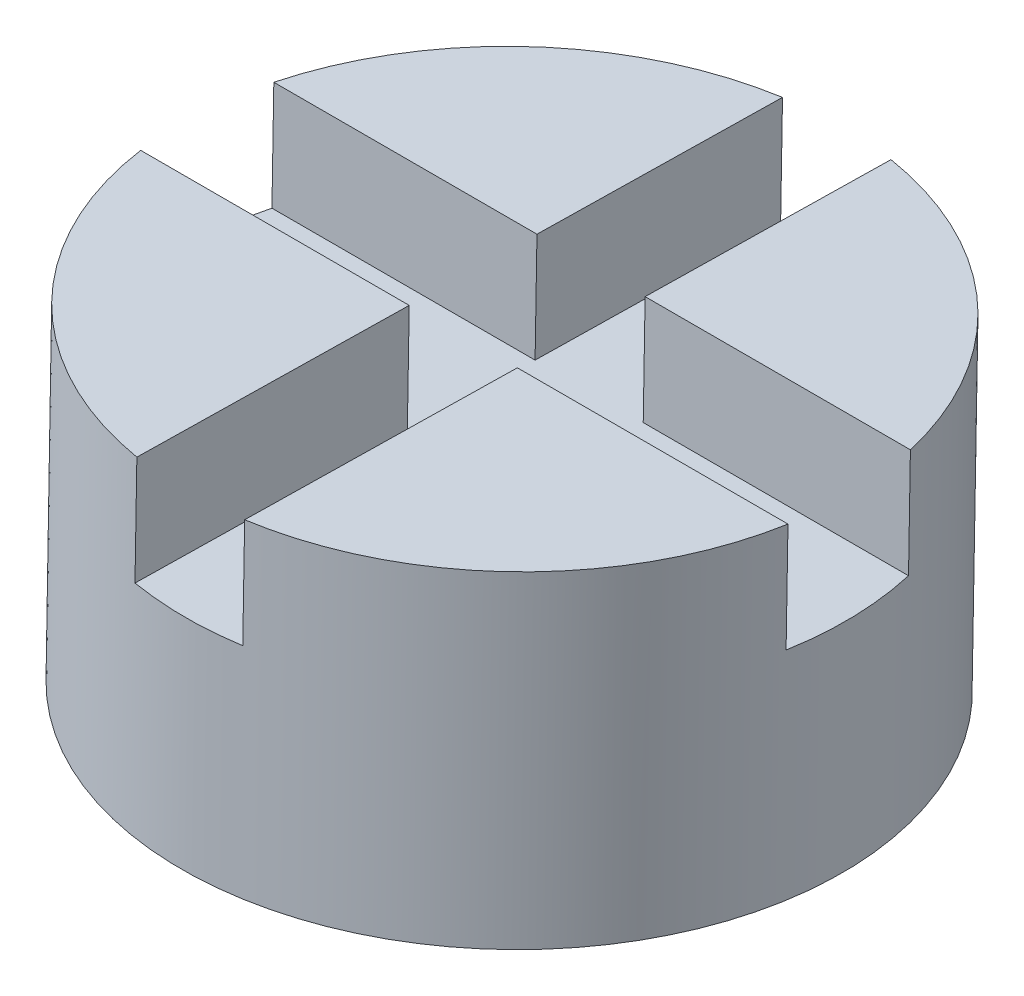
ISO-10303-21;
HEADER;
FILE_DESCRIPTION(('STEP AP214'),'2;1');
FILE_NAME('part.step','',(''),(''),'','','');
FILE_SCHEMA(('AUTOMOTIVE_DESIGN { 1 0 10303 214 1 1 1 1 }'));
ENDSEC;
DATA;
#1=APPLICATION_CONTEXT('core data for automotive mechanical design processes');
#2=APPLICATION_PROTOCOL_DEFINITION('international standard','automotive_design',2000,#1);
#3=PRODUCT_CONTEXT('',#1,'mechanical');
#4=PRODUCT('Part','Part','',(#3));
#5=PRODUCT_RELATED_PRODUCT_CATEGORY('part','',(#4));
#6=PRODUCT_DEFINITION_FORMATION('','',#4);
#7=PRODUCT_DEFINITION_CONTEXT('part definition',#1,'design');
#8=PRODUCT_DEFINITION('design','',#6,#7);
#9=PRODUCT_DEFINITION_SHAPE('','',#8);
#10=(LENGTH_UNIT() NAMED_UNIT(*) SI_UNIT(.MILLI.,.METRE.));
#11=(NAMED_UNIT(*) PLANE_ANGLE_UNIT() SI_UNIT($,.RADIAN.));
#12=(NAMED_UNIT(*) SI_UNIT($,.STERADIAN.) SOLID_ANGLE_UNIT());
#13=UNCERTAINTY_MEASURE_WITH_UNIT(LENGTH_MEASURE(1.E-05),#10,'distance_accuracy_value','');
#14=(GEOMETRIC_REPRESENTATION_CONTEXT(3) GLOBAL_UNCERTAINTY_ASSIGNED_CONTEXT((#13)) GLOBAL_UNIT_ASSIGNED_CONTEXT((#10,
#11,#12)) REPRESENTATION_CONTEXT('',''));
#15=CARTESIAN_POINT('',(0.,0.,0.));
#16=DIRECTION('',(0.,0.,1.));
#17=DIRECTION('',(1.,0.,0.));
#18=AXIS2_PLACEMENT_3D('',#15,#16,#17);
#19=CARTESIAN_POINT('',(0.,42.7310366721,-0.7458730195362));
#20=DIRECTION('',(0.,0.999847695156402,-0.01745240643669));
#21=DIRECTION('',(0.,0.01745240643669,0.999847695156402));
#22=AXIS2_PLACEMENT_3D('',#19,#20,#21);
#23=PLANE('',#22);
#24=DIRECTION('',(1.,0.,0.));
#25=VECTOR('',#24,1.);
#26=CARTESIAN_POINT('',(9.600000000002,42.65502475476,-5.10059284769757));
#27=LINE('',#26,#25);
#28=CARTESIAN_POINT('',(9.600000000002,42.65502475476,-5.10059284769786));
#29=VERTEX_POINT('',#28);
#30=CARTESIAN_POINT('',(7.16644649162946,42.6550247547625,-5.10059284769762));
#31=VERTEX_POINT('',#30);
#32=EDGE_CURVE('E110',#29,#31,#27,.F.);
#33=ORIENTED_EDGE('',*,*,#32,.T.);
#34=CARTESIAN_POINT('',(10.10987591935,42.6674999797288,-4.38588768809348));
#35=DIRECTION('',(0.,-0.999847695156402,0.01745240643669));
#36=DIRECTION('',(0.,-0.01745240643669,-0.999847695156402));
#37=AXIS2_PLACEMENT_3D('',#34,#35,#36);
#38=CIRCLE('',#37,3.02898264973);
#39=CARTESIAN_POINT('',(7.11708140464571,42.67564703682,-3.91914309991675));
#40=VERTEX_POINT('',#39);
#41=EDGE_CURVE('E119',#31,#40,#38,.F.);
#42=ORIENTED_EDGE('',*,*,#41,.T.);
#43=DIRECTION('',(1.,0.,0.));
#44=VECTOR('',#43,1.);
#45=CARTESIAN_POINT('',(6.911601811216,42.67564703682,-3.91914309991675));
#46=LINE('',#45,#44);
#47=CARTESIAN_POINT('',(9.600000000002,42.67564703682,-3.91914309991675));
#48=VERTEX_POINT('',#47);
#49=EDGE_CURVE('E199',#40,#48,#46,.T.);
#50=ORIENTED_EDGE('',*,*,#49,.T.);
#51=DIRECTION('',(0.,0.0174524064357844,0.999847695156417));
#52=VECTOR('',#51,1.);
#53=CARTESIAN_POINT('',(9.600000000002,42.67564703682,-3.919143099917));
#54=LINE('',#53,#52);
#55=CARTESIAN_POINT('',(9.600000000002,42.7196086757766,-1.40058249045737));
#56=VERTEX_POINT('',#55);
#57=EDGE_CURVE('E162',#48,#56,#54,.T.);
#58=ORIENTED_EDGE('',*,*,#57,.T.);
#59=CARTESIAN_POINT('',(10.10987591935,42.6674999797224,-4.38588768809337));
#60=DIRECTION('',(0.,-0.999847695156402,0.01745240643669));
#61=DIRECTION('',(0.,-0.01745240643669,-0.999847695156402));
#62=AXIS2_PLACEMENT_3D('',#59,#60,#61);
#63=CIRCLE('',#62,3.02898264973);
#64=CARTESIAN_POINT('',(10.6,42.7196663706962,-1.39727715047166));
#65=VERTEX_POINT('',#64);
#66=EDGE_CURVE('E19',#56,#65,#63,.F.);
#67=ORIENTED_EDGE('',*,*,#66,.T.);
#68=DIRECTION('',(0.,-0.0174524064341796,-0.999847695156445));
#69=VECTOR('',#68,1.);
#70=CARTESIAN_POINT('',(10.6,42.7196663707,-1.397277150472));
#71=LINE('',#70,#69);
#72=CARTESIAN_POINT('',(10.6,42.67564703682,-3.91914309991692));
#73=VERTEX_POINT('',#72);
#74=EDGE_CURVE('E159',#65,#73,#71,.T.);
#75=ORIENTED_EDGE('',*,*,#74,.T.);
#76=DIRECTION('',(1.,0.,0.));
#77=VECTOR('',#76,1.);
#78=CARTESIAN_POINT('',(10.6,42.67564703682,-3.91914309991675));
#79=LINE('',#78,#77);
#80=CARTESIAN_POINT('',(13.1026704340513,42.6756470368206,-3.91914309991676));
#81=VERTEX_POINT('',#80);
#82=EDGE_CURVE('E92',#73,#81,#79,.T.);
#83=ORIENTED_EDGE('',*,*,#82,.T.);
#84=CARTESIAN_POINT('',(10.10987591935,42.667499979725,-4.38588768809342));
#85=DIRECTION('',(0.,-0.999847695156402,0.01745240643669));
#86=DIRECTION('',(0.,-0.01745240643669,-0.999847695156402));
#87=AXIS2_PLACEMENT_3D('',#84,#85,#86);
#88=CIRCLE('',#87,3.02898264973);
#89=CARTESIAN_POINT('',(13.0533053470695,42.65502475476,-5.10059284769757));
#90=VERTEX_POINT('',#89);
#91=EDGE_CURVE('E153',#81,#90,#88,.F.);
#92=ORIENTED_EDGE('',*,*,#91,.T.);
#93=DIRECTION('',(1.,0.,0.));
#94=VECTOR('',#93,1.);
#95=CARTESIAN_POINT('',(13.33208830923,42.65502475476,-5.10059284769757));
#96=LINE('',#95,#94);
#97=CARTESIAN_POINT('',(10.6,42.65502475476,-5.10059284769757));
#98=VERTEX_POINT('',#97);
#99=EDGE_CURVE('E185',#90,#98,#96,.F.);
#100=ORIENTED_EDGE('',*,*,#99,.T.);
#101=DIRECTION('',(0.,-0.0174524064355643,-0.999847695156421));
#102=VECTOR('',#101,1.);
#103=CARTESIAN_POINT('',(10.6,42.65502475476,-5.100592847698));
#104=LINE('',#103,#102);
#105=CARTESIAN_POINT('',(10.6,42.615333588748,-7.37449822571496));
#106=VERTEX_POINT('',#105);
#107=EDGE_CURVE('E128',#98,#106,#104,.T.);
#108=ORIENTED_EDGE('',*,*,#107,.T.);
#109=CARTESIAN_POINT('',(10.10987591935,42.6674999797235,-4.38588768809339));
#110=DIRECTION('',(0.,-0.999847695156402,0.01745240643669));
#111=DIRECTION('',(0.,-0.01745240643669,-0.999847695156402));
#112=AXIS2_PLACEMENT_3D('',#109,#110,#111);
#113=CIRCLE('',#112,3.02898264973);
#114=CARTESIAN_POINT('',(9.600000000002,42.615391283669,-7.37119288572947));
#115=VERTEX_POINT('',#114);
#116=EDGE_CURVE('E131',#106,#115,#113,.F.);
#117=ORIENTED_EDGE('',*,*,#116,.T.);
#118=DIRECTION('',(0.,0.0174524064373433,0.99984769515639));
#119=VECTOR('',#118,1.);
#120=CARTESIAN_POINT('',(9.600000000002,42.61539128367,-7.37119288573));
#121=LINE('',#120,#119);
#122=EDGE_CURVE('E124',#115,#29,#121,.T.);
#123=ORIENTED_EDGE('',*,*,#122,.T.);
#124=EDGE_LOOP('',(#33,#42,#50,#58,#67,#75,#83,#92,#100,#108,#117,#123));
#125=FACE_BOUND('',#124,.T.);
#126=ADVANCED_FACE('F16',(#125),#23,.T.);
#127=CARTESIAN_POINT('',(9.600000000002,44.26003482339,-5.128608402655));
#128=DIRECTION('',(0.,-0.01745240643669,-0.999847695156402));
#129=DIRECTION('',(0.,0.999847695156402,-0.01745240643669));
#130=AXIS2_PLACEMENT_3D('',#127,#128,#129);
#131=PLANE('',#130);
#132=ORIENTED_EDGE('',*,*,#32,.F.);
#133=DIRECTION('',(0.,0.999847695156397,-0.0174524064369368));
#134=VECTOR('',#133,1.);
#135=CARTESIAN_POINT('',(9.600000000002,42.65502475476,-5.100592847698));
#136=LINE('',#135,#134);
#137=CARTESIAN_POINT('',(9.600000000002,43.6548724499178,-5.11804525413496));
#138=VERTEX_POINT('',#137);
#139=EDGE_CURVE('E114',#29,#138,#136,.T.);
#140=ORIENTED_EDGE('',*,*,#139,.T.);
#141=DIRECTION('',(1.,0.,0.));
#142=VECTOR('',#141,1.);
#143=CARTESIAN_POINT('',(0.,43.6548724499178,-5.11804525413496));
#144=LINE('',#143,#142);
#145=CARTESIAN_POINT('',(7.16644649162954,43.6548724499189,-5.11804525413481));
#146=VERTEX_POINT('',#145);
#147=EDGE_CURVE('E240',#146,#138,#144,.T.);
#148=ORIENTED_EDGE('',*,*,#147,.F.);
#149=DIRECTION('',(0.,0.999847695156402,-0.01745240643669));
#150=VECTOR('',#149,1.);
#151=CARTESIAN_POINT('',(7.166446491628,44.26003482339,-5.128608402655));
#152=LINE('',#151,#150);
#153=EDGE_CURVE('E116',#31,#146,#152,.T.);
#154=ORIENTED_EDGE('',*,*,#153,.F.);
#155=EDGE_LOOP('',(#132,#140,#148,#154));
#156=FACE_BOUND('',#155,.T.);
#157=ADVANCED_FACE('F112',(#156),#131,.F.);
#158=CARTESIAN_POINT('',(9.600000000002,44.21761459672,-7.55886156085));
#159=DIRECTION('',(-1.,0.,0.));
#160=DIRECTION('',(0.,0.,1.));
#161=AXIS2_PLACEMENT_3D('',#158,#159,#160);
#162=PLANE('',#161);
#163=ORIENTED_EDGE('',*,*,#122,.F.);
#164=DIRECTION('',(0.,-0.999847695156415,0.0174524064359379));
#165=VECTOR('',#164,1.);
#166=CARTESIAN_POINT('',(9.600000000002,43.61523897883,-7.388645292166));
#167=LINE('',#166,#165);
#168=CARTESIAN_POINT('',(9.600000000002,43.6152389788304,-7.38864529216587));
#169=VERTEX_POINT('',#168);
#170=EDGE_CURVE('E132',#169,#115,#167,.T.);
#171=ORIENTED_EDGE('',*,*,#170,.F.);
#172=DIRECTION('',(0.,0.01745240643669,0.999847695156402));
#173=VECTOR('',#172,1.);
#174=CARTESIAN_POINT('',(9.600000000002,43.73088436726,-0.7633254259729));
#175=LINE('',#174,#173);
#176=EDGE_CURVE('E127',#138,#169,#175,.F.);
#177=ORIENTED_EDGE('',*,*,#176,.F.);
#178=ORIENTED_EDGE('',*,*,#139,.F.);
#179=EDGE_LOOP('',(#163,#171,#177,#178));
#180=FACE_BOUND('',#179,.T.);
#181=ADVANCED_FACE('F123',(#180),#162,.F.);
#182=CARTESIAN_POINT('',(10.6,44.26003482339,-5.128608402655));
#183=DIRECTION('',(1.,0.,0.));
#184=DIRECTION('',(0.,0.,-1.));
#185=AXIS2_PLACEMENT_3D('',#182,#183,#184);
#186=PLANE('',#185);
#187=ORIENTED_EDGE('',*,*,#107,.F.);
#188=DIRECTION('',(0.,0.999847695156402,-0.01745240643669));
#189=VECTOR('',#188,1.);
#190=CARTESIAN_POINT('',(10.6,44.26003482339,-5.128608402655));
#191=LINE('',#190,#189);
#192=CARTESIAN_POINT('',(10.6,43.6548724499178,-5.11804525413474));
#193=VERTEX_POINT('',#192);
#194=EDGE_CURVE('E187',#98,#193,#191,.T.);
#195=ORIENTED_EDGE('',*,*,#194,.T.);
#196=DIRECTION('',(0.,0.01745240643669,0.999847695156402));
#197=VECTOR('',#196,1.);
#198=CARTESIAN_POINT('',(10.6,43.73088436726,-0.7633254259729));
#199=LINE('',#198,#197);
#200=CARTESIAN_POINT('',(10.6,43.6151812839076,-7.39195063215202));
#201=VERTEX_POINT('',#200);
#202=EDGE_CURVE('E224',#201,#193,#199,.T.);
#203=ORIENTED_EDGE('',*,*,#202,.F.);
#204=DIRECTION('',(0.,0.999847695156397,-0.0174524064369369));
#205=VECTOR('',#204,1.);
#206=CARTESIAN_POINT('',(10.6,42.61533358875,-7.374498225715));
#207=LINE('',#206,#205);
#208=EDGE_CURVE('E186',#106,#201,#207,.T.);
#209=ORIENTED_EDGE('',*,*,#208,.F.);
#210=EDGE_LOOP('',(#187,#195,#203,#209));
#211=FACE_BOUND('',#210,.T.);
#212=ADVANCED_FACE('F280',(#211),#186,.F.);
#213=CARTESIAN_POINT('',(13.33208830923,44.26003482339,-5.128608402655));
#214=DIRECTION('',(0.,-0.01745240643669,-0.999847695156402));
#215=DIRECTION('',(0.,0.999847695156402,-0.01745240643669));
#216=AXIS2_PLACEMENT_3D('',#213,#214,#215);
#217=PLANE('',#216);
#218=ORIENTED_EDGE('',*,*,#99,.F.);
#219=DIRECTION('',(0.,0.999847695156402,-0.01745240643669));
#220=VECTOR('',#219,1.);
#221=CARTESIAN_POINT('',(13.05330534707,44.26003482339,-5.128608402655));
#222=LINE('',#221,#220);
#223=CARTESIAN_POINT('',(13.0533053470695,43.6548724499202,-5.11804525413483));
#224=VERTEX_POINT('',#223);
#225=EDGE_CURVE('E182',#224,#90,#222,.F.);
#226=ORIENTED_EDGE('',*,*,#225,.F.);
#227=DIRECTION('',(1.,0.,0.));
#228=VECTOR('',#227,1.);
#229=CARTESIAN_POINT('',(0.,43.6548724499178,-5.11804525413496));
#230=LINE('',#229,#228);
#231=EDGE_CURVE('E225',#193,#224,#230,.T.);
#232=ORIENTED_EDGE('',*,*,#231,.F.);
#233=ORIENTED_EDGE('',*,*,#194,.F.);
#234=EDGE_LOOP('',(#218,#226,#232,#233));
#235=FACE_BOUND('',#234,.T.);
#236=ADVANCED_FACE('F216',(#235),#217,.F.);
#237=CARTESIAN_POINT('',(10.6,44.28065710544,-3.947158654874));
#238=DIRECTION('',(0.,0.01745240643669,0.999847695156402));
#239=DIRECTION('',(0.,-0.999847695156402,0.01745240643669));
#240=AXIS2_PLACEMENT_3D('',#237,#238,#239);
#241=PLANE('',#240);
#242=ORIENTED_EDGE('',*,*,#82,.F.);
#243=DIRECTION('',(0.,0.999847695156394,-0.0174524064371123));
#244=VECTOR('',#243,1.);
#245=CARTESIAN_POINT('',(10.6,42.67564703682,-3.919143099917));
#246=LINE('',#245,#244);
#247=CARTESIAN_POINT('',(10.6,43.6754947319741,-3.93659550635407));
#248=VERTEX_POINT('',#247);
#249=EDGE_CURVE('E168',#73,#248,#246,.T.);
#250=ORIENTED_EDGE('',*,*,#249,.T.);
#251=DIRECTION('',(1.,0.,0.));
#252=VECTOR('',#251,1.);
#253=CARTESIAN_POINT('',(0.,43.6754947319741,-3.93659550635407));
#254=LINE('',#253,#252);
#255=CARTESIAN_POINT('',(13.1026704340513,43.675494731972,-3.93659550635387));
#256=VERTEX_POINT('',#255);
#257=EDGE_CURVE('E226',#256,#248,#254,.F.);
#258=ORIENTED_EDGE('',*,*,#257,.F.);
#259=DIRECTION('',(0.,-0.999847695156402,0.01745240643669));
#260=VECTOR('',#259,1.);
#261=CARTESIAN_POINT('',(13.10267043405,44.28065710544,-3.947158654874));
#262=LINE('',#261,#260);
#263=EDGE_CURVE('E172',#81,#256,#262,.F.);
#264=ORIENTED_EDGE('',*,*,#263,.F.);
#265=EDGE_LOOP('',(#242,#250,#258,#264));
#266=FACE_BOUND('',#265,.T.);
#267=ADVANCED_FACE('F271',(#266),#241,.F.);
#268=CARTESIAN_POINT('',(10.6,44.32732700522,-1.273441887067));
#269=DIRECTION('',(1.,0.,0.));
#270=DIRECTION('',(0.,0.,-1.));
#271=AXIS2_PLACEMENT_3D('',#268,#269,#270);
#272=PLANE('',#271);
#273=ORIENTED_EDGE('',*,*,#74,.F.);
#274=DIRECTION('',(0.,-0.999847695156397,0.017452406436937));
#275=VECTOR('',#274,1.);
#276=CARTESIAN_POINT('',(10.6,43.71951406586,-1.414729556909));
#277=LINE('',#276,#275);
#278=CARTESIAN_POINT('',(10.6,43.7195140658584,-1.41472955690858));
#279=VERTEX_POINT('',#278);
#280=EDGE_CURVE('E166',#279,#65,#277,.T.);
#281=ORIENTED_EDGE('',*,*,#280,.F.);
#282=DIRECTION('',(0.,0.01745240643669,0.999847695156402));
#283=VECTOR('',#282,1.);
#284=CARTESIAN_POINT('',(10.6,43.73088436726,-0.7633254259729));
#285=LINE('',#284,#283);
#286=EDGE_CURVE('E229',#248,#279,#285,.T.);
#287=ORIENTED_EDGE('',*,*,#286,.F.);
#288=ORIENTED_EDGE('',*,*,#249,.F.);
#289=EDGE_LOOP('',(#273,#281,#287,#288));
#290=FACE_BOUND('',#289,.T.);
#291=ADVANCED_FACE('F164',(#290),#272,.F.);
#292=CARTESIAN_POINT('',(9.600000000002,44.28065710544,-3.947158654874));
#293=DIRECTION('',(-1.,0.,0.));
#294=DIRECTION('',(0.,0.,1.));
#295=AXIS2_PLACEMENT_3D('',#292,#293,#294);
#296=PLANE('',#295);
#297=ORIENTED_EDGE('',*,*,#57,.F.);
#298=DIRECTION('',(0.,-0.999847695156402,0.01745240643669));
#299=VECTOR('',#298,1.);
#300=CARTESIAN_POINT('',(9.600000000002,44.28065710544,-3.947158654874));
#301=LINE('',#300,#299);
#302=CARTESIAN_POINT('',(9.600000000002,43.6754947319741,-3.93659550635385));
#303=VERTEX_POINT('',#302);
#304=EDGE_CURVE('E201',#48,#303,#301,.F.);
#305=ORIENTED_EDGE('',*,*,#304,.T.);
#306=DIRECTION('',(0.,0.01745240643669,0.999847695156402));
#307=VECTOR('',#306,1.);
#308=CARTESIAN_POINT('',(9.600000000002,43.73088436726,-0.7633254259729));
#309=LINE('',#308,#307);
#310=CARTESIAN_POINT('',(9.600000000002,43.7194563709382,-1.41803489689428));
#311=VERTEX_POINT('',#310);
#312=EDGE_CURVE('E254',#311,#303,#309,.F.);
#313=ORIENTED_EDGE('',*,*,#312,.F.);
#314=DIRECTION('',(0.,0.999847695156397,-0.0174524064369373));
#315=VECTOR('',#314,1.);
#316=CARTESIAN_POINT('',(9.600000000002,42.71960867578,-1.400582490457));
#317=LINE('',#316,#315);
#318=EDGE_CURVE('E177',#56,#311,#317,.T.);
#319=ORIENTED_EDGE('',*,*,#318,.F.);
#320=EDGE_LOOP('',(#297,#305,#313,#319));
#321=FACE_BOUND('',#320,.T.);
#322=ADVANCED_FACE('F252',(#321),#296,.F.);
#323=CARTESIAN_POINT('',(6.911601811216,44.28065710544,-3.947158654874));
#324=DIRECTION('',(0.,0.01745240643669,0.999847695156402));
#325=DIRECTION('',(0.,-0.999847695156402,0.01745240643669));
#326=AXIS2_PLACEMENT_3D('',#323,#324,#325);
#327=PLANE('',#326);
#328=ORIENTED_EDGE('',*,*,#49,.F.);
#329=DIRECTION('',(0.,-0.999847695156402,0.01745240643669));
#330=VECTOR('',#329,1.);
#331=CARTESIAN_POINT('',(7.117081404644,44.28065710544,-3.947158654874));
#332=LINE('',#331,#330);
#333=CARTESIAN_POINT('',(7.11708140464566,43.6754947319759,-3.93659550635394));
#334=VERTEX_POINT('',#333);
#335=EDGE_CURVE('E34',#334,#40,#332,.T.);
#336=ORIENTED_EDGE('',*,*,#335,.F.);
#337=DIRECTION('',(1.,0.,0.));
#338=VECTOR('',#337,1.);
#339=CARTESIAN_POINT('',(0.,43.6754947319741,-3.93659550635407));
#340=LINE('',#339,#338);
#341=EDGE_CURVE('E151',#303,#334,#340,.F.);
#342=ORIENTED_EDGE('',*,*,#341,.F.);
#343=ORIENTED_EDGE('',*,*,#304,.F.);
#344=EDGE_LOOP('',(#328,#336,#342,#343));
#345=FACE_BOUND('',#344,.T.);
#346=ADVANCED_FACE('F257',(#345),#327,.F.);
#347=CARTESIAN_POINT('',(0.,43.73088436726,-0.7633254259729));
#348=DIRECTION('',(0.,0.999847695156402,-0.01745240643669));
#349=DIRECTION('',(0.,0.01745240643669,0.999847695156402));
#350=AXIS2_PLACEMENT_3D('',#347,#348,#349);
#351=PLANE('',#350);
#352=ORIENTED_EDGE('',*,*,#147,.T.);
#353=ORIENTED_EDGE('',*,*,#176,.T.);
#354=CARTESIAN_POINT('',(10.10987591935,43.667347674885,-4.40334009453017));
#355=DIRECTION('',(0.,-0.999847695156402,0.01745240643669));
#356=DIRECTION('',(0.,-0.01745240643669,-0.999847695156402));
#357=AXIS2_PLACEMENT_3D('',#354,#355,#356);
#358=CIRCLE('',#357,3.02898264973);
#359=EDGE_CURVE('E148',#146,#169,#358,.T.);
#360=ORIENTED_EDGE('',*,*,#359,.F.);
#361=EDGE_LOOP('',(#352,#353,#360));
#362=FACE_BOUND('',#361,.T.);
#363=ADVANCED_FACE('F300',(#362),#351,.T.);
#364=CARTESIAN_POINT('',(0.,43.73088436726,-0.7633254259729));
#365=DIRECTION('',(0.,0.999847695156402,-0.01745240643669));
#366=DIRECTION('',(0.,0.01745240643669,0.999847695156402));
#367=AXIS2_PLACEMENT_3D('',#364,#365,#366);
#368=PLANE('',#367);
#369=ORIENTED_EDGE('',*,*,#202,.T.);
#370=ORIENTED_EDGE('',*,*,#231,.T.);
#371=CARTESIAN_POINT('',(10.10987591935,43.6673476748876,-4.40334009453022));
#372=DIRECTION('',(0.,-0.999847695156402,0.01745240643669));
#373=DIRECTION('',(0.,-0.01745240643669,-0.999847695156402));
#374=AXIS2_PLACEMENT_3D('',#371,#372,#373);
#375=CIRCLE('',#374,3.02898264973);
#376=EDGE_CURVE('E145',#201,#224,#375,.T.);
#377=ORIENTED_EDGE('',*,*,#376,.F.);
#378=EDGE_LOOP('',(#369,#370,#377));
#379=FACE_BOUND('',#378,.T.);
#380=ADVANCED_FACE('F223',(#379),#368,.T.);
#381=CARTESIAN_POINT('',(0.,43.73088436726,-0.7633254259729));
#382=DIRECTION('',(0.,0.999847695156402,-0.01745240643669));
#383=DIRECTION('',(0.,0.01745240643669,0.999847695156402));
#384=AXIS2_PLACEMENT_3D('',#381,#382,#383);
#385=PLANE('',#384);
#386=ORIENTED_EDGE('',*,*,#257,.T.);
#387=ORIENTED_EDGE('',*,*,#286,.T.);
#388=CARTESIAN_POINT('',(10.10987591935,43.6673476748788,-4.40334009453006));
#389=DIRECTION('',(0.,-0.999847695156402,0.01745240643669));
#390=DIRECTION('',(0.,-0.01745240643669,-0.999847695156402));
#391=AXIS2_PLACEMENT_3D('',#388,#389,#390);
#392=CIRCLE('',#391,3.02898264973);
#393=EDGE_CURVE('E142',#256,#279,#392,.T.);
#394=ORIENTED_EDGE('',*,*,#393,.F.);
#395=EDGE_LOOP('',(#386,#387,#394));
#396=FACE_BOUND('',#395,.T.);
#397=ADVANCED_FACE('F269',(#396),#385,.T.);
#398=CARTESIAN_POINT('',(0.,43.73088436726,-0.7633254259729));
#399=DIRECTION('',(0.,0.999847695156402,-0.01745240643669));
#400=DIRECTION('',(0.,0.01745240643669,0.999847695156402));
#401=AXIS2_PLACEMENT_3D('',#398,#399,#400);
#402=PLANE('',#401);
#403=ORIENTED_EDGE('',*,*,#312,.T.);
#404=ORIENTED_EDGE('',*,*,#341,.T.);
#405=CARTESIAN_POINT('',(10.10987591935,43.6673476748865,-4.4033400945302));
#406=DIRECTION('',(0.,-0.999847695156402,0.01745240643669));
#407=DIRECTION('',(0.,-0.01745240643669,-0.999847695156402));
#408=AXIS2_PLACEMENT_3D('',#405,#406,#407);
#409=CIRCLE('',#408,3.02898264973);
#410=EDGE_CURVE('E25',#311,#334,#409,.T.);
#411=ORIENTED_EDGE('',*,*,#410,.F.);
#412=EDGE_LOOP('',(#403,#404,#411));
#413=FACE_BOUND('',#412,.T.);
#414=ADVANCED_FACE('F289',(#413),#402,.T.);
#415=CARTESIAN_POINT('',(10.10987591935,40.66780458941,-4.35098287522));
#416=DIRECTION('',(0.,-0.999847695156402,0.01745240643669));
#417=DIRECTION('',(0.,-0.01745240643669,-0.999847695156402));
#418=AXIS2_PLACEMENT_3D('',#415,#416,#417);
#419=CYLINDRICAL_SURFACE('',#418,3.02898264973);
#420=CARTESIAN_POINT('',(10.10987591935,40.66780458941,-4.35098287522));
#421=DIRECTION('',(0.,-0.999847695156402,0.01745240643669));
#422=DIRECTION('',(0.,-0.01745240643669,-0.999847695156402));
#423=AXIS2_PLACEMENT_3D('',#420,#421,#422);
#424=CIRCLE('',#423,3.02898264973);
#425=CARTESIAN_POINT('',(10.10987591935,40.6149415531172,-7.37950419622127));
#426=VERTEX_POINT('',#425);
#427=EDGE_CURVE('E11',#426,#426,#424,.F.);
#428=ORIENTED_EDGE('',*,*,#427,.T.);
#429=EDGE_LOOP('',(#428));
#430=FACE_BOUND('',#429,.T.);
#431=ORIENTED_EDGE('',*,*,#335,.T.);
#432=ORIENTED_EDGE('',*,*,#41,.F.);
#433=ORIENTED_EDGE('',*,*,#153,.T.);
#434=ORIENTED_EDGE('',*,*,#359,.T.);
#435=ORIENTED_EDGE('',*,*,#170,.T.);
#436=ORIENTED_EDGE('',*,*,#116,.F.);
#437=ORIENTED_EDGE('',*,*,#208,.T.);
#438=ORIENTED_EDGE('',*,*,#376,.T.);
#439=ORIENTED_EDGE('',*,*,#225,.T.);
#440=ORIENTED_EDGE('',*,*,#91,.F.);
#441=ORIENTED_EDGE('',*,*,#263,.T.);
#442=ORIENTED_EDGE('',*,*,#393,.T.);
#443=ORIENTED_EDGE('',*,*,#280,.T.);
#444=ORIENTED_EDGE('',*,*,#66,.F.);
#445=ORIENTED_EDGE('',*,*,#318,.T.);
#446=ORIENTED_EDGE('',*,*,#410,.T.);
#447=EDGE_LOOP('',(#431,#432,#433,#434,#435,#436,#437,#438,#439,#440,#441,#442,#443,#444,#445,#446));
#448=FACE_BOUND('',#447,.T.);
#449=ADVANCED_FACE('F170',(#430,#448),#419,.T.);
#450=CARTESIAN_POINT('',(0.,40.73134128179,-0.7109682066629));
#451=DIRECTION('',(0.,0.999847695156402,-0.01745240643669));
#452=DIRECTION('',(0.,0.01745240643669,0.999847695156402));
#453=AXIS2_PLACEMENT_3D('',#450,#451,#452);
#454=PLANE('',#453);
#455=ORIENTED_EDGE('',*,*,#427,.F.);
#456=EDGE_LOOP('',(#455));
#457=FACE_BOUND('',#456,.T.);
#458=ADVANCED_FACE('F282',(#457),#454,.F.);
#459=CLOSED_SHELL('',(#126,#157,#181,#212,#236,#267,#291,#322,#346,#363,#380,#397,#414,#449,#458));
#460=MANIFOLD_SOLID_BREP('B1',#459);
#461=ADVANCED_BREP_SHAPE_REPRESENTATION('',(#18,#460),#14);
#462=SHAPE_DEFINITION_REPRESENTATION(#9,#461);
ENDSEC;
END-ISO-10303-21;
